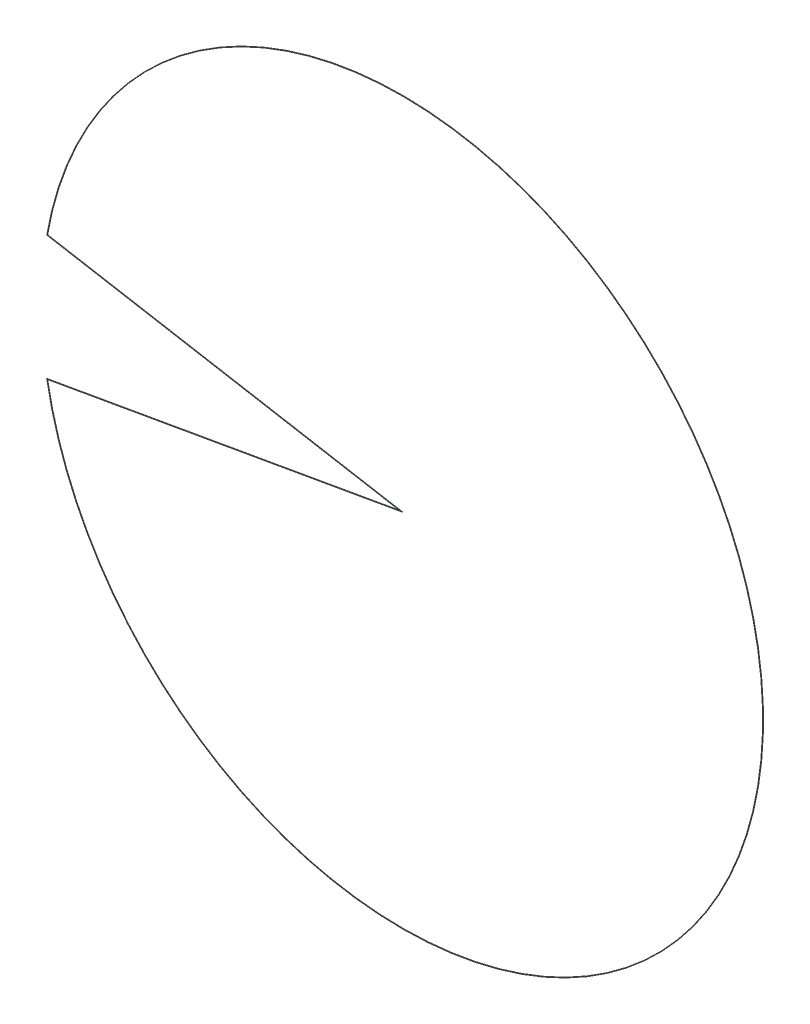
ISO-10303-21;
HEADER;
FILE_DESCRIPTION(('STEP AP214'),'2;1');
FILE_NAME('part.step','',(''),(''),'','','');
FILE_SCHEMA(('AUTOMOTIVE_DESIGN { 1 0 10303 214 1 1 1 1 }'));
ENDSEC;
DATA;
#1=APPLICATION_CONTEXT('core data for automotive mechanical design processes');
#2=APPLICATION_PROTOCOL_DEFINITION('international standard','automotive_design',2000,#1);
#3=PRODUCT_CONTEXT('',#1,'mechanical');
#4=PRODUCT('Part','Part','',(#3));
#5=PRODUCT_RELATED_PRODUCT_CATEGORY('part','',(#4));
#6=PRODUCT_DEFINITION_FORMATION('','',#4);
#7=PRODUCT_DEFINITION_CONTEXT('part definition',#1,'design');
#8=PRODUCT_DEFINITION('design','',#6,#7);
#9=PRODUCT_DEFINITION_SHAPE('','',#8);
#10=(LENGTH_UNIT() NAMED_UNIT(*) SI_UNIT(.MILLI.,.METRE.));
#11=(NAMED_UNIT(*) PLANE_ANGLE_UNIT() SI_UNIT($,.RADIAN.));
#12=(NAMED_UNIT(*) SI_UNIT($,.STERADIAN.) SOLID_ANGLE_UNIT());
#13=UNCERTAINTY_MEASURE_WITH_UNIT(LENGTH_MEASURE(1.E-05),#10,'distance_accuracy_value','');
#14=(GEOMETRIC_REPRESENTATION_CONTEXT(3) GLOBAL_UNCERTAINTY_ASSIGNED_CONTEXT((#13)) GLOBAL_UNIT_ASSIGNED_CONTEXT((#10,
#11,#12)) REPRESENTATION_CONTEXT('',''));
#15=CARTESIAN_POINT('',(0.,0.,0.));
#16=DIRECTION('',(0.,0.,1.));
#17=DIRECTION('',(1.,0.,0.));
#18=AXIS2_PLACEMENT_3D('',#15,#16,#17);
#19=CARTESIAN_POINT('',(0.,0.,1.));
#20=DIRECTION('',(0.,0.,1.));
#21=DIRECTION('',(1.,0.,0.));
#22=AXIS2_PLACEMENT_3D('',#19,#20,#21);
#23=PLANE('',#22);
#24=DIRECTION('',(-0.984807753012208,0.17364817766693,0.));
#25=VECTOR('',#24,1.);
#26=CARTESIAN_POINT('',(0.,0.,1.));
#27=LINE('',#26,#25);
#28=CARTESIAN_POINT('',(0.,0.,1.));
#29=VERTEX_POINT('',#28);
#30=CARTESIAN_POINT('',(-807.542357470011,142.391505686883,1.));
#31=VERTEX_POINT('',#30);
#32=EDGE_CURVE('E11',#29,#31,#27,.T.);
#33=ORIENTED_EDGE('',*,*,#32,.T.);
#34=CARTESIAN_POINT('',(0.,0.,1.));
#35=DIRECTION('',(0.,0.,-1.));
#36=DIRECTION('',(1.,0.,0.));
#37=AXIS2_PLACEMENT_3D('',#34,#35,#36);
#38=CIRCLE('',#37,820.);
#39=CARTESIAN_POINT('',(-807.542357470011,-142.391505686883,1.));
#40=VERTEX_POINT('',#39);
#41=EDGE_CURVE('E60',#31,#40,#38,.T.);
#42=ORIENTED_EDGE('',*,*,#41,.T.);
#43=DIRECTION('',(-0.984807753012208,-0.17364817766693,0.));
#44=VECTOR('',#43,1.);
#45=CARTESIAN_POINT('',(0.,0.,1.));
#46=LINE('',#45,#44);
#47=EDGE_CURVE('E139',#29,#40,#46,.T.);
#48=ORIENTED_EDGE('',*,*,#47,.F.);
#49=EDGE_LOOP('',(#33,#42,#48));
#50=FACE_BOUND('',#49,.T.);
#51=DIRECTION('',(-0.984807753012208,-0.17364817766693,0.));
#52=VECTOR('',#51,1.);
#53=CARTESIAN_POINT('',(-0.17364817766693,0.984807753012208,1.));
#54=LINE('',#53,#52);
#55=CARTESIAN_POINT('',(-5.75877048314364,0.,1.));
#56=VERTEX_POINT('',#55);
#57=CARTESIAN_POINT('',(-808.700213639351,-141.580240357431,1.));
#58=VERTEX_POINT('',#57);
#59=EDGE_CURVE('E155',#56,#58,#54,.T.);
#60=ORIENTED_EDGE('',*,*,#59,.T.);
#61=CARTESIAN_POINT('',(0.,0.,1.));
#62=DIRECTION('',(0.,0.,1.));
#63=DIRECTION('',(1.,0.,0.));
#64=AXIS2_PLACEMENT_3D('',#61,#62,#63);
#65=CIRCLE('',#64,821.);
#66=CARTESIAN_POINT('',(-808.700213639351,141.580240357431,1.));
#67=VERTEX_POINT('',#66);
#68=EDGE_CURVE('E135',#58,#67,#65,.T.);
#69=ORIENTED_EDGE('',*,*,#68,.T.);
#70=DIRECTION('',(-0.984807753012208,0.17364817766693,0.));
#71=VECTOR('',#70,1.);
#72=CARTESIAN_POINT('',(-0.17364817766693,-0.984807753012208,1.));
#73=LINE('',#72,#71);
#74=EDGE_CURVE('E167',#56,#67,#73,.T.);
#75=ORIENTED_EDGE('',*,*,#74,.F.);
#76=EDGE_LOOP('',(#60,#69,#75));
#77=FACE_BOUND('',#76,.T.);
#78=ADVANCED_FACE('F49',(#50,#77),#23,.T.);
#79=CARTESIAN_POINT('',(0.,0.,0.));
#80=DIRECTION('',(0.,0.,-1.));
#81=DIRECTION('',(0.,-1.,0.));
#82=AXIS2_PLACEMENT_3D('',#79,#80,#81);
#83=PLANE('',#82);
#84=CARTESIAN_POINT('',(0.,0.,0.));
#85=DIRECTION('',(0.,0.,1.));
#86=DIRECTION('',(1.,0.,0.));
#87=AXIS2_PLACEMENT_3D('',#84,#85,#86);
#88=CIRCLE('',#87,820.);
#89=CARTESIAN_POINT('',(-807.542357470011,-142.391505686883,0.));
#90=VERTEX_POINT('',#89);
#91=CARTESIAN_POINT('',(-807.542357470011,142.391505686883,0.));
#92=VERTEX_POINT('',#91);
#93=EDGE_CURVE('E124',#90,#92,#88,.T.);
#94=ORIENTED_EDGE('',*,*,#93,.T.);
#95=DIRECTION('',(-0.984807753012208,0.17364817766693,0.));
#96=VECTOR('',#95,1.);
#97=CARTESIAN_POINT('',(0.,0.,0.));
#98=LINE('',#97,#96);
#99=CARTESIAN_POINT('',(0.,0.,0.));
#100=VERTEX_POINT('',#99);
#101=EDGE_CURVE('E113',#100,#92,#98,.T.);
#102=ORIENTED_EDGE('',*,*,#101,.F.);
#103=DIRECTION('',(-0.984807753012208,-0.17364817766693,0.));
#104=VECTOR('',#103,1.);
#105=CARTESIAN_POINT('',(0.,0.,0.));
#106=LINE('',#105,#104);
#107=EDGE_CURVE('E122',#100,#90,#106,.T.);
#108=ORIENTED_EDGE('',*,*,#107,.T.);
#109=EDGE_LOOP('',(#94,#102,#108));
#110=FACE_BOUND('',#109,.T.);
#111=DIRECTION('',(-0.984807753012208,0.17364817766693,0.));
#112=VECTOR('',#111,1.);
#113=CARTESIAN_POINT('',(-0.17364817766693,-0.984807753012208,0.));
#114=LINE('',#113,#112);
#115=CARTESIAN_POINT('',(-5.75877048314364,0.,0.));
#116=VERTEX_POINT('',#115);
#117=CARTESIAN_POINT('',(-808.700213639351,141.580240357431,0.));
#118=VERTEX_POINT('',#117);
#119=EDGE_CURVE('E129',#116,#118,#114,.T.);
#120=ORIENTED_EDGE('',*,*,#119,.T.);
#121=CARTESIAN_POINT('',(0.,0.,0.));
#122=DIRECTION('',(0.,0.,1.));
#123=DIRECTION('',(1.,0.,0.));
#124=AXIS2_PLACEMENT_3D('',#121,#122,#123);
#125=CIRCLE('',#124,821.);
#126=CARTESIAN_POINT('',(-808.700213639351,-141.580240357431,0.));
#127=VERTEX_POINT('',#126);
#128=EDGE_CURVE('E185',#127,#118,#125,.T.);
#129=ORIENTED_EDGE('',*,*,#128,.F.);
#130=DIRECTION('',(-0.984807753012208,-0.17364817766693,0.));
#131=VECTOR('',#130,1.);
#132=CARTESIAN_POINT('',(-0.17364817766693,0.984807753012208,0.));
#133=LINE('',#132,#131);
#134=EDGE_CURVE('E89',#116,#127,#133,.T.);
#135=ORIENTED_EDGE('',*,*,#134,.F.);
#136=EDGE_LOOP('',(#120,#129,#135));
#137=FACE_BOUND('',#136,.T.);
#138=ADVANCED_FACE('F51',(#110,#137),#83,.T.);
#139=CARTESIAN_POINT('',(0.,0.,0.));
#140=DIRECTION('',(-0.17364817766693,0.984807753012208,0.));
#141=DIRECTION('',(0.,0.,1.));
#142=AXIS2_PLACEMENT_3D('',#139,#140,#141);
#143=PLANE('',#142);
#144=ORIENTED_EDGE('',*,*,#47,.T.);
#145=DIRECTION('',(0.,0.,1.));
#146=VECTOR('',#145,1.);
#147=CARTESIAN_POINT('',(-807.542357470011,-142.391505686883,0.));
#148=LINE('',#147,#146);
#149=EDGE_CURVE('E132',#90,#40,#148,.T.);
#150=ORIENTED_EDGE('',*,*,#149,.F.);
#151=ORIENTED_EDGE('',*,*,#107,.F.);
#152=DIRECTION('',(0.,0.,1.));
#153=VECTOR('',#152,1.);
#154=CARTESIAN_POINT('',(0.,0.,0.));
#155=LINE('',#154,#153);
#156=EDGE_CURVE('E141',#100,#29,#155,.T.);
#157=ORIENTED_EDGE('',*,*,#156,.T.);
#158=EDGE_LOOP('',(#144,#150,#151,#157));
#159=FACE_BOUND('',#158,.T.);
#160=ADVANCED_FACE('F137',(#159),#143,.F.);
#161=CARTESIAN_POINT('',(0.,0.,0.));
#162=DIRECTION('',(0.,0.,1.));
#163=DIRECTION('',(1.,0.,0.));
#164=AXIS2_PLACEMENT_3D('',#161,#162,#163);
#165=CYLINDRICAL_SURFACE('',#164,820.);
#166=ORIENTED_EDGE('',*,*,#41,.F.);
#167=DIRECTION('',(0.,0.,1.));
#168=VECTOR('',#167,1.);
#169=CARTESIAN_POINT('',(-807.542357470011,142.391505686883,0.));
#170=LINE('',#169,#168);
#171=EDGE_CURVE('E133',#92,#31,#170,.T.);
#172=ORIENTED_EDGE('',*,*,#171,.F.);
#173=ORIENTED_EDGE('',*,*,#93,.F.);
#174=ORIENTED_EDGE('',*,*,#149,.T.);
#175=EDGE_LOOP('',(#166,#172,#173,#174));
#176=FACE_BOUND('',#175,.T.);
#177=ADVANCED_FACE('F131',(#176),#165,.F.);
#178=CARTESIAN_POINT('',(0.,0.,0.));
#179=DIRECTION('',(0.17364817766693,0.984807753012208,0.));
#180=DIRECTION('',(0.,0.,-1.));
#181=AXIS2_PLACEMENT_3D('',#178,#179,#180);
#182=PLANE('',#181);
#183=ORIENTED_EDGE('',*,*,#32,.F.);
#184=ORIENTED_EDGE('',*,*,#156,.F.);
#185=ORIENTED_EDGE('',*,*,#101,.T.);
#186=ORIENTED_EDGE('',*,*,#171,.T.);
#187=EDGE_LOOP('',(#183,#184,#185,#186));
#188=FACE_BOUND('',#187,.T.);
#189=ADVANCED_FACE('F203',(#188),#182,.T.);
#190=CARTESIAN_POINT('',(0.,0.,0.));
#191=DIRECTION('',(0.,0.,1.));
#192=DIRECTION('',(1.,0.,0.));
#193=AXIS2_PLACEMENT_3D('',#190,#191,#192);
#194=CYLINDRICAL_SURFACE('',#193,821.);
#195=ORIENTED_EDGE('',*,*,#68,.F.);
#196=DIRECTION('',(0.,0.,1.));
#197=VECTOR('',#196,1.);
#198=CARTESIAN_POINT('',(-808.700213639351,-141.580240357431,0.));
#199=LINE('',#198,#197);
#200=EDGE_CURVE('E159',#127,#58,#199,.T.);
#201=ORIENTED_EDGE('',*,*,#200,.F.);
#202=ORIENTED_EDGE('',*,*,#128,.T.);
#203=DIRECTION('',(0.,0.,1.));
#204=VECTOR('',#203,1.);
#205=CARTESIAN_POINT('',(-808.700213639351,141.580240357431,0.));
#206=LINE('',#205,#204);
#207=EDGE_CURVE('E53',#118,#67,#206,.T.);
#208=ORIENTED_EDGE('',*,*,#207,.T.);
#209=EDGE_LOOP('',(#195,#201,#202,#208));
#210=FACE_BOUND('',#209,.T.);
#211=ADVANCED_FACE('F214',(#210),#194,.T.);
#212=CARTESIAN_POINT('',(-0.17364817766693,0.984807753012208,0.));
#213=DIRECTION('',(-0.17364817766693,0.984807753012208,0.));
#214=DIRECTION('',(0.,0.,1.));
#215=AXIS2_PLACEMENT_3D('',#212,#213,#214);
#216=PLANE('',#215);
#217=ORIENTED_EDGE('',*,*,#59,.F.);
#218=DIRECTION('',(0.,0.,1.));
#219=VECTOR('',#218,1.);
#220=CARTESIAN_POINT('',(-5.75877048314364,0.,0.));
#221=LINE('',#220,#219);
#222=EDGE_CURVE('E164',#116,#56,#221,.T.);
#223=ORIENTED_EDGE('',*,*,#222,.F.);
#224=ORIENTED_EDGE('',*,*,#134,.T.);
#225=ORIENTED_EDGE('',*,*,#200,.T.);
#226=EDGE_LOOP('',(#217,#223,#224,#225));
#227=FACE_BOUND('',#226,.T.);
#228=ADVANCED_FACE('F212',(#227),#216,.T.);
#229=CARTESIAN_POINT('',(-0.17364817766693,-0.984807753012208,0.));
#230=DIRECTION('',(0.17364817766693,0.984807753012208,0.));
#231=DIRECTION('',(0.,0.,-1.));
#232=AXIS2_PLACEMENT_3D('',#229,#230,#231);
#233=PLANE('',#232);
#234=ORIENTED_EDGE('',*,*,#74,.T.);
#235=ORIENTED_EDGE('',*,*,#207,.F.);
#236=ORIENTED_EDGE('',*,*,#119,.F.);
#237=ORIENTED_EDGE('',*,*,#222,.T.);
#238=EDGE_LOOP('',(#234,#235,#236,#237));
#239=FACE_BOUND('',#238,.T.);
#240=ADVANCED_FACE('F190',(#239),#233,.F.);
#241=CLOSED_SHELL('',(#78,#138,#160,#177,#189,#211,#228,#240));
#242=MANIFOLD_SOLID_BREP('B2',#241);
#243=ADVANCED_BREP_SHAPE_REPRESENTATION('',(#18,#242),#14);
#244=SHAPE_DEFINITION_REPRESENTATION(#9,#243);
ENDSEC;
END-ISO-10303-21;
